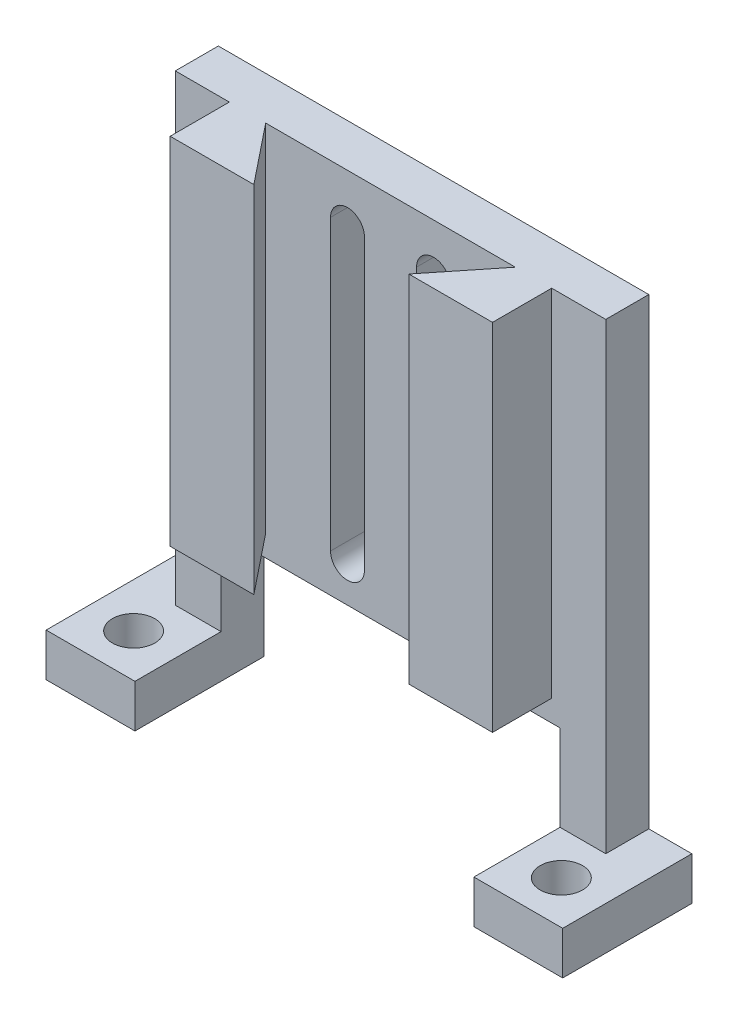
ISO-10303-21;
HEADER;
FILE_DESCRIPTION(('STEP AP214'),'2;1');
FILE_NAME('part.step','',(''),(''),'','','');
FILE_SCHEMA(('AUTOMOTIVE_DESIGN { 1 0 10303 214 1 1 1 1 }'));
ENDSEC;
DATA;
#1=APPLICATION_CONTEXT('core data for automotive mechanical design processes');
#2=APPLICATION_PROTOCOL_DEFINITION('international standard','automotive_design',2000,#1);
#3=PRODUCT_CONTEXT('',#1,'mechanical');
#4=PRODUCT('Part','Part','',(#3));
#5=PRODUCT_RELATED_PRODUCT_CATEGORY('part','',(#4));
#6=PRODUCT_DEFINITION_FORMATION('','',#4);
#7=PRODUCT_DEFINITION_CONTEXT('part definition',#1,'design');
#8=PRODUCT_DEFINITION('design','',#6,#7);
#9=PRODUCT_DEFINITION_SHAPE('','',#8);
#10=(LENGTH_UNIT() NAMED_UNIT(*) SI_UNIT(.MILLI.,.METRE.));
#11=(NAMED_UNIT(*) PLANE_ANGLE_UNIT() SI_UNIT($,.RADIAN.));
#12=(NAMED_UNIT(*) SI_UNIT($,.STERADIAN.) SOLID_ANGLE_UNIT());
#13=UNCERTAINTY_MEASURE_WITH_UNIT(LENGTH_MEASURE(1.E-05),#10,'distance_accuracy_value','');
#14=(GEOMETRIC_REPRESENTATION_CONTEXT(3) GLOBAL_UNCERTAINTY_ASSIGNED_CONTEXT((#13)) GLOBAL_UNIT_ASSIGNED_CONTEXT((#10,
#11,#12)) REPRESENTATION_CONTEXT('',''));
#15=CARTESIAN_POINT('',(0.,0.,0.));
#16=DIRECTION('',(0.,0.,1.));
#17=DIRECTION('',(1.,0.,0.));
#18=AXIS2_PLACEMENT_3D('',#15,#16,#17);
#19=CARTESIAN_POINT('',(0.,0.,5.08));
#20=DIRECTION('',(1.,0.,0.));
#21=DIRECTION('',(0.,0.,-1.));
#22=AXIS2_PLACEMENT_3D('',#19,#20,#21);
#23=PLANE('',#22);
#24=DIRECTION('',(0.,0.,-1.));
#25=VECTOR('',#24,1.);
#26=CARTESIAN_POINT('',(0.,0.,15.24));
#27=LINE('',#26,#25);
#28=CARTESIAN_POINT('',(0.,0.,5.08));
#29=VERTEX_POINT('',#28);
#30=CARTESIAN_POINT('',(0.,0.,0.));
#31=VERTEX_POINT('',#30);
#32=EDGE_CURVE('E41',#29,#31,#27,.T.);
#33=ORIENTED_EDGE('',*,*,#32,.F.);
#34=DIRECTION('',(0.,-1.,0.));
#35=VECTOR('',#34,1.);
#36=CARTESIAN_POINT('',(0.,0.,5.08));
#37=LINE('',#36,#35);
#38=CARTESIAN_POINT('',(0.,54.61,5.08));
#39=VERTEX_POINT('',#38);
#40=EDGE_CURVE('E443',#39,#29,#37,.T.);
#41=ORIENTED_EDGE('',*,*,#40,.F.);
#42=DIRECTION('',(0.,0.,-1.));
#43=VECTOR('',#42,1.);
#44=CARTESIAN_POINT('',(0.,54.61,5.08));
#45=LINE('',#44,#43);
#46=CARTESIAN_POINT('',(0.,54.61,0.));
#47=VERTEX_POINT('',#46);
#48=EDGE_CURVE('E457',#39,#47,#45,.T.);
#49=ORIENTED_EDGE('',*,*,#48,.T.);
#50=DIRECTION('',(0.,-1.,0.));
#51=VECTOR('',#50,1.);
#52=CARTESIAN_POINT('',(0.,0.,0.));
#53=LINE('',#52,#51);
#54=EDGE_CURVE('E434',#47,#31,#53,.T.);
#55=ORIENTED_EDGE('',*,*,#54,.T.);
#56=EDGE_LOOP('',(#33,#41,#49,#55));
#57=FACE_BOUND('',#56,.T.);
#58=ADVANCED_FACE('F33',(#57),#23,.F.);
#59=CARTESIAN_POINT('',(0.,0.,0.));
#60=DIRECTION('',(0.,1.,0.));
#61=DIRECTION('',(0.,0.,1.));
#62=AXIS2_PLACEMENT_3D('',#59,#60,#61);
#63=PLANE('',#62);
#64=CARTESIAN_POINT('',(50.64,0.,10.16));
#65=DIRECTION('',(0.,1.,0.));
#66=DIRECTION('',(0.,0.,-1.));
#67=AXIS2_PLACEMENT_3D('',#64,#65,#66);
#68=CIRCLE('',#67,2.5);
#69=CARTESIAN_POINT('',(50.64,0.,7.65999999999998));
#70=VERTEX_POINT('',#69);
#71=EDGE_CURVE('E579',#70,#70,#68,.T.);
#72=ORIENTED_EDGE('',*,*,#71,.F.);
#73=EDGE_LOOP('',(#72));
#74=FACE_BOUND('',#73,.T.);
#75=DIRECTION('',(0.,0.,-1.));
#76=VECTOR('',#75,1.);
#77=CARTESIAN_POINT('',(45.4,0.,0.));
#78=LINE('',#77,#76);
#79=CARTESIAN_POINT('',(45.4,0.,15.24));
#80=VERTEX_POINT('',#79);
#81=CARTESIAN_POINT('',(45.4,0.,5.08));
#82=VERTEX_POINT('',#81);
#83=EDGE_CURVE('E305',#80,#82,#78,.T.);
#84=ORIENTED_EDGE('',*,*,#83,.F.);
#85=DIRECTION('',(-1.,0.,0.));
#86=VECTOR('',#85,1.);
#87=CARTESIAN_POINT('',(0.,0.,15.24));
#88=LINE('',#87,#86);
#89=CARTESIAN_POINT('',(55.88,0.,15.24));
#90=VERTEX_POINT('',#89);
#91=EDGE_CURVE('E332',#90,#80,#88,.T.);
#92=ORIENTED_EDGE('',*,*,#91,.F.);
#93=DIRECTION('',(0.,0.,-1.));
#94=VECTOR('',#93,1.);
#95=CARTESIAN_POINT('',(55.88,0.,15.24));
#96=LINE('',#95,#94);
#97=CARTESIAN_POINT('',(55.88,0.,0.));
#98=VERTEX_POINT('',#97);
#99=EDGE_CURVE('E250',#90,#98,#96,.T.);
#100=ORIENTED_EDGE('',*,*,#99,.T.);
#101=DIRECTION('',(-1.,0.,0.));
#102=VECTOR('',#101,1.);
#103=CARTESIAN_POINT('',(55.88,0.,0.));
#104=LINE('',#103,#102);
#105=CARTESIAN_POINT('',(50.8,0.,0.));
#106=VERTEX_POINT('',#105);
#107=EDGE_CURVE('E49',#98,#106,#104,.T.);
#108=ORIENTED_EDGE('',*,*,#107,.T.);
#109=DIRECTION('',(0.,0.,-1.));
#110=VECTOR('',#109,1.);
#111=CARTESIAN_POINT('',(50.8,0.,15.24));
#112=LINE('',#111,#110);
#113=CARTESIAN_POINT('',(50.8,0.,5.08));
#114=VERTEX_POINT('',#113);
#115=EDGE_CURVE('E12',#114,#106,#112,.T.);
#116=ORIENTED_EDGE('',*,*,#115,.F.);
#117=DIRECTION('',(1.,0.,0.));
#118=VECTOR('',#117,1.);
#119=CARTESIAN_POINT('',(0.,0.,5.08));
#120=LINE('',#119,#118);
#121=EDGE_CURVE('E446',#82,#114,#120,.T.);
#122=ORIENTED_EDGE('',*,*,#121,.F.);
#123=EDGE_LOOP('',(#84,#92,#100,#108,#116,#122));
#124=FACE_BOUND('',#123,.T.);
#125=ADVANCED_FACE('F537',(#74,#124),#63,.T.);
#126=CARTESIAN_POINT('',(0.,-5.08,15.24));
#127=DIRECTION('',(0.,0.,-1.));
#128=DIRECTION('',(-1.,0.,0.));
#129=AXIS2_PLACEMENT_3D('',#126,#127,#128);
#130=PLANE('',#129);
#131=ORIENTED_EDGE('',*,*,#91,.T.);
#132=DIRECTION('',(0.,-1.,0.));
#133=VECTOR('',#132,1.);
#134=CARTESIAN_POINT('',(45.4,-5.08000000000002,15.24));
#135=LINE('',#134,#133);
#136=CARTESIAN_POINT('',(45.4,-5.08,15.24));
#137=VERTEX_POINT('',#136);
#138=EDGE_CURVE('E237',#80,#137,#135,.T.);
#139=ORIENTED_EDGE('',*,*,#138,.T.);
#140=DIRECTION('',(-1.,0.,0.));
#141=VECTOR('',#140,1.);
#142=CARTESIAN_POINT('',(0.,-5.08,15.24));
#143=LINE('',#142,#141);
#144=CARTESIAN_POINT('',(55.88,-5.08,15.24));
#145=VERTEX_POINT('',#144);
#146=EDGE_CURVE('E231',#145,#137,#143,.T.);
#147=ORIENTED_EDGE('',*,*,#146,.F.);
#148=DIRECTION('',(0.,1.,0.));
#149=VECTOR('',#148,1.);
#150=CARTESIAN_POINT('',(55.88,-5.08,15.24));
#151=LINE('',#150,#149);
#152=EDGE_CURVE('E235',#145,#90,#151,.T.);
#153=ORIENTED_EDGE('',*,*,#152,.T.);
#154=EDGE_LOOP('',(#131,#139,#147,#153));
#155=FACE_BOUND('',#154,.T.);
#156=ADVANCED_FACE('F234',(#155),#130,.F.);
#157=CARTESIAN_POINT('',(0.,-5.08,0.));
#158=DIRECTION('',(0.,1.,0.));
#159=DIRECTION('',(0.,0.,1.));
#160=AXIS2_PLACEMENT_3D('',#157,#158,#159);
#161=PLANE('',#160);
#162=CARTESIAN_POINT('',(50.64,-5.08,10.16));
#163=DIRECTION('',(0.,1.,0.));
#164=DIRECTION('',(0.,0.,-1.));
#165=AXIS2_PLACEMENT_3D('',#162,#163,#164);
#166=CIRCLE('',#165,2.5);
#167=CARTESIAN_POINT('',(50.64,-5.08,7.65999999999998));
#168=VERTEX_POINT('',#167);
#169=EDGE_CURVE('E574',#168,#168,#166,.T.);
#170=ORIENTED_EDGE('',*,*,#169,.T.);
#171=EDGE_LOOP('',(#170));
#172=FACE_BOUND('',#171,.T.);
#173=ORIENTED_EDGE('',*,*,#146,.T.);
#174=DIRECTION('',(0.,0.,1.));
#175=VECTOR('',#174,1.);
#176=CARTESIAN_POINT('',(45.4,-5.08,-42.8048782266694));
#177=LINE('',#176,#175);
#178=CARTESIAN_POINT('',(45.4,-5.08,0.));
#179=VERTEX_POINT('',#178);
#180=EDGE_CURVE('E279',#179,#137,#177,.T.);
#181=ORIENTED_EDGE('',*,*,#180,.F.);
#182=DIRECTION('',(1.,0.,0.));
#183=VECTOR('',#182,1.);
#184=CARTESIAN_POINT('',(0.,-5.08,0.));
#185=LINE('',#184,#183);
#186=CARTESIAN_POINT('',(55.88,-5.08,0.));
#187=VERTEX_POINT('',#186);
#188=EDGE_CURVE('E255',#179,#187,#185,.T.);
#189=ORIENTED_EDGE('',*,*,#188,.T.);
#190=DIRECTION('',(0.,0.,1.));
#191=VECTOR('',#190,1.);
#192=CARTESIAN_POINT('',(55.88,-5.08,15.24));
#193=LINE('',#192,#191);
#194=EDGE_CURVE('E248',#187,#145,#193,.T.);
#195=ORIENTED_EDGE('',*,*,#194,.T.);
#196=EDGE_LOOP('',(#173,#181,#189,#195));
#197=FACE_BOUND('',#196,.T.);
#198=ADVANCED_FACE('F253',(#172,#197),#161,.F.);
#199=CARTESIAN_POINT('',(50.8,0.,5.08));
#200=DIRECTION('',(-1.,0.,0.));
#201=DIRECTION('',(0.,0.,1.));
#202=AXIS2_PLACEMENT_3D('',#199,#200,#201);
#203=PLANE('',#202);
#204=DIRECTION('',(0.,1.,0.));
#205=VECTOR('',#204,1.);
#206=CARTESIAN_POINT('',(50.8,0.,5.08));
#207=LINE('',#206,#205);
#208=CARTESIAN_POINT('',(50.8,54.61,5.08));
#209=VERTEX_POINT('',#208);
#210=EDGE_CURVE('E451',#114,#209,#207,.T.);
#211=ORIENTED_EDGE('',*,*,#210,.F.);
#212=ORIENTED_EDGE('',*,*,#115,.T.);
#213=DIRECTION('',(0.,1.,0.));
#214=VECTOR('',#213,1.);
#215=CARTESIAN_POINT('',(50.8,0.,0.));
#216=LINE('',#215,#214);
#217=CARTESIAN_POINT('',(50.8,54.61,0.));
#218=VERTEX_POINT('',#217);
#219=EDGE_CURVE('E460',#106,#218,#216,.T.);
#220=ORIENTED_EDGE('',*,*,#219,.T.);
#221=DIRECTION('',(0.,0.,-1.));
#222=VECTOR('',#221,1.);
#223=CARTESIAN_POINT('',(50.8,54.61,5.08));
#224=LINE('',#223,#222);
#225=EDGE_CURVE('E464',#209,#218,#224,.T.);
#226=ORIENTED_EDGE('',*,*,#225,.F.);
#227=EDGE_LOOP('',(#211,#212,#220,#226));
#228=FACE_BOUND('',#227,.T.);
#229=ADVANCED_FACE('F505',(#228),#203,.F.);
#230=CARTESIAN_POINT('',(0.,54.61,5.08));
#231=DIRECTION('',(0.,-1.,0.));
#232=DIRECTION('',(0.,0.,-1.));
#233=AXIS2_PLACEMENT_3D('',#230,#231,#232);
#234=PLANE('',#233);
#235=DIRECTION('',(-1.,0.,0.));
#236=VECTOR('',#235,1.);
#237=CARTESIAN_POINT('',(0.,54.61,0.));
#238=LINE('',#237,#236);
#239=EDGE_CURVE('E447',#218,#47,#238,.T.);
#240=ORIENTED_EDGE('',*,*,#239,.T.);
#241=ORIENTED_EDGE('',*,*,#48,.F.);
#242=DIRECTION('',(-1.,0.,0.));
#243=VECTOR('',#242,1.);
#244=CARTESIAN_POINT('',(0.,54.61,5.08));
#245=LINE('',#244,#243);
#246=CARTESIAN_POINT('',(6.38056504409611,54.61,5.08));
#247=VERTEX_POINT('',#246);
#248=EDGE_CURVE('E453',#247,#39,#245,.T.);
#249=ORIENTED_EDGE('',*,*,#248,.F.);
#250=DIRECTION('',(0.,0.,-1.));
#251=VECTOR('',#250,1.);
#252=CARTESIAN_POINT('',(6.38056504409611,54.61,5.08));
#253=LINE('',#252,#251);
#254=CARTESIAN_POINT('',(6.38056504409611,54.61,12.065));
#255=VERTEX_POINT('',#254);
#256=EDGE_CURVE('E401',#255,#247,#253,.T.);
#257=ORIENTED_EDGE('',*,*,#256,.F.);
#258=DIRECTION('',(-1.,0.,0.));
#259=VECTOR('',#258,1.);
#260=CARTESIAN_POINT('',(6.38056504409611,54.61,12.065));
#261=LINE('',#260,#259);
#262=CARTESIAN_POINT('',(16.256,54.61,12.065));
#263=VERTEX_POINT('',#262);
#264=EDGE_CURVE('E407',#263,#255,#261,.T.);
#265=ORIENTED_EDGE('',*,*,#264,.F.);
#266=DIRECTION('',(0.624695047554424,0.,0.78086880944303));
#267=VECTOR('',#266,1.);
#268=CARTESIAN_POINT('',(16.256,54.61,12.065));
#269=LINE('',#268,#267);
#270=CARTESIAN_POINT('',(10.668,54.61,5.08));
#271=VERTEX_POINT('',#270);
#272=EDGE_CURVE('E404',#271,#263,#269,.T.);
#273=ORIENTED_EDGE('',*,*,#272,.F.);
#274=CARTESIAN_POINT('',(40.132,54.61,5.08));
#275=VERTEX_POINT('',#274);
#276=EDGE_CURVE('E458',#275,#271,#245,.T.);
#277=ORIENTED_EDGE('',*,*,#276,.F.);
#278=DIRECTION('',(0.624695047554424,0.,-0.78086880944303));
#279=VECTOR('',#278,1.);
#280=CARTESIAN_POINT('',(34.544,54.61,12.065));
#281=LINE('',#280,#279);
#282=CARTESIAN_POINT('',(34.544,54.61,12.065));
#283=VERTEX_POINT('',#282);
#284=EDGE_CURVE('E425',#283,#275,#281,.T.);
#285=ORIENTED_EDGE('',*,*,#284,.F.);
#286=DIRECTION('',(-1.,0.,0.));
#287=VECTOR('',#286,1.);
#288=CARTESIAN_POINT('',(44.4194349559039,54.61,12.065));
#289=LINE('',#288,#287);
#290=CARTESIAN_POINT('',(44.4194349559039,54.61,12.065));
#291=VERTEX_POINT('',#290);
#292=EDGE_CURVE('E414',#291,#283,#289,.T.);
#293=ORIENTED_EDGE('',*,*,#292,.F.);
#294=DIRECTION('',(0.,0.,1.));
#295=VECTOR('',#294,1.);
#296=CARTESIAN_POINT('',(44.4194349559039,54.61,5.08));
#297=LINE('',#296,#295);
#298=CARTESIAN_POINT('',(44.4194349559039,54.61,5.08));
#299=VERTEX_POINT('',#298);
#300=EDGE_CURVE('E427',#299,#291,#297,.T.);
#301=ORIENTED_EDGE('',*,*,#300,.F.);
#302=EDGE_CURVE('E454',#209,#299,#245,.T.);
#303=ORIENTED_EDGE('',*,*,#302,.F.);
#304=ORIENTED_EDGE('',*,*,#225,.T.);
#305=EDGE_LOOP('',(#240,#241,#249,#257,#265,#273,#277,#285,#293,#301,#303,#304));
#306=FACE_BOUND('',#305,.T.);
#307=ADVANCED_FACE('F484',(#306),#234,.F.);
#308=CARTESIAN_POINT('',(0.,0.,5.08));
#309=DIRECTION('',(0.,0.,-1.));
#310=DIRECTION('',(-1.,0.,0.));
#311=AXIS2_PLACEMENT_3D('',#308,#309,#310);
#312=PLANE('',#311);
#313=CARTESIAN_POINT('',(20.32,14.7,5.08));
#314=DIRECTION('',(0.,0.,-1.));
#315=DIRECTION('',(-1.,0.,0.));
#316=AXIS2_PLACEMENT_3D('',#313,#314,#315);
#317=CIRCLE('',#316,1.99999999999999);
#318=CARTESIAN_POINT('',(22.32,14.7,5.08));
#319=VERTEX_POINT('',#318);
#320=CARTESIAN_POINT('',(18.32,14.7,5.08));
#321=VERTEX_POINT('',#320);
#322=EDGE_CURVE('E393',#319,#321,#317,.T.);
#323=ORIENTED_EDGE('',*,*,#322,.T.);
#324=DIRECTION('',(0.,1.,0.));
#325=VECTOR('',#324,1.);
#326=CARTESIAN_POINT('',(18.32,0.,5.08));
#327=LINE('',#326,#325);
#328=CARTESIAN_POINT('',(18.32,48.8,5.08));
#329=VERTEX_POINT('',#328);
#330=EDGE_CURVE('E390',#321,#329,#327,.T.);
#331=ORIENTED_EDGE('',*,*,#330,.T.);
#332=CARTESIAN_POINT('',(20.32,48.8,5.08));
#333=DIRECTION('',(0.,0.,-1.));
#334=DIRECTION('',(-1.,0.,0.));
#335=AXIS2_PLACEMENT_3D('',#332,#333,#334);
#336=CIRCLE('',#335,2.);
#337=CARTESIAN_POINT('',(22.32,48.8,5.08));
#338=VERTEX_POINT('',#337);
#339=EDGE_CURVE('E398',#329,#338,#336,.T.);
#340=ORIENTED_EDGE('',*,*,#339,.T.);
#341=DIRECTION('',(0.,-1.,0.));
#342=VECTOR('',#341,1.);
#343=CARTESIAN_POINT('',(22.32,0.,5.08));
#344=LINE('',#343,#342);
#345=EDGE_CURVE('E395',#338,#319,#344,.T.);
#346=ORIENTED_EDGE('',*,*,#345,.T.);
#347=EDGE_LOOP('',(#323,#331,#340,#346));
#348=FACE_BOUND('',#347,.T.);
#349=CARTESIAN_POINT('',(30.48,14.7,5.08));
#350=DIRECTION('',(0.,0.,-1.));
#351=DIRECTION('',(-1.,0.,0.));
#352=AXIS2_PLACEMENT_3D('',#349,#350,#351);
#353=CIRCLE('',#352,1.99999999999999);
#354=CARTESIAN_POINT('',(32.48,14.7,5.08));
#355=VERTEX_POINT('',#354);
#356=CARTESIAN_POINT('',(28.48,14.7,5.08));
#357=VERTEX_POINT('',#356);
#358=EDGE_CURVE('E382',#355,#357,#353,.T.);
#359=ORIENTED_EDGE('',*,*,#358,.T.);
#360=DIRECTION('',(0.,1.,0.));
#361=VECTOR('',#360,1.);
#362=CARTESIAN_POINT('',(28.48,0.,5.08));
#363=LINE('',#362,#361);
#364=CARTESIAN_POINT('',(28.48,48.8,5.08));
#365=VERTEX_POINT('',#364);
#366=EDGE_CURVE('E351',#357,#365,#363,.T.);
#367=ORIENTED_EDGE('',*,*,#366,.T.);
#368=CARTESIAN_POINT('',(30.48,48.8,5.08));
#369=DIRECTION('',(0.,0.,-1.));
#370=DIRECTION('',(-1.,0.,0.));
#371=AXIS2_PLACEMENT_3D('',#368,#369,#370);
#372=CIRCLE('',#371,2.);
#373=CARTESIAN_POINT('',(32.48,48.8,5.08));
#374=VERTEX_POINT('',#373);
#375=EDGE_CURVE('E387',#365,#374,#372,.T.);
#376=ORIENTED_EDGE('',*,*,#375,.T.);
#377=DIRECTION('',(0.,-1.,0.));
#378=VECTOR('',#377,1.);
#379=CARTESIAN_POINT('',(32.48,0.,5.08));
#380=LINE('',#379,#378);
#381=EDGE_CURVE('E384',#374,#355,#380,.T.);
#382=ORIENTED_EDGE('',*,*,#381,.T.);
#383=EDGE_LOOP('',(#359,#367,#376,#382));
#384=FACE_BOUND('',#383,.T.);
#385=DIRECTION('',(1.,0.,0.));
#386=VECTOR('',#385,1.);
#387=CARTESIAN_POINT('',(0.,10.16,5.08));
#388=LINE('',#387,#386);
#389=CARTESIAN_POINT('',(5.39999999999999,10.16,5.07999999999999));
#390=VERTEX_POINT('',#389);
#391=CARTESIAN_POINT('',(45.4,10.16,5.07999999999999));
#392=VERTEX_POINT('',#391);
#393=EDGE_CURVE('E310',#390,#392,#388,.T.);
#394=ORIENTED_EDGE('',*,*,#393,.T.);
#395=DIRECTION('',(0.,-1.,0.));
#396=VECTOR('',#395,1.);
#397=CARTESIAN_POINT('',(45.4,0.,5.08));
#398=LINE('',#397,#396);
#399=EDGE_CURVE('E307',#392,#82,#398,.T.);
#400=ORIENTED_EDGE('',*,*,#399,.T.);
#401=ORIENTED_EDGE('',*,*,#121,.T.);
#402=ORIENTED_EDGE('',*,*,#210,.T.);
#403=ORIENTED_EDGE('',*,*,#302,.T.);
#404=DIRECTION('',(0.,-1.,0.));
#405=VECTOR('',#404,1.);
#406=CARTESIAN_POINT('',(44.4194349559039,54.61,5.08));
#407=LINE('',#406,#405);
#408=CARTESIAN_POINT('',(44.4194349559039,12.7,5.07999999999999));
#409=VERTEX_POINT('',#408);
#410=EDGE_CURVE('E435',#299,#409,#407,.T.);
#411=ORIENTED_EDGE('',*,*,#410,.T.);
#412=DIRECTION('',(-1.,0.,0.));
#413=VECTOR('',#412,1.);
#414=CARTESIAN_POINT('',(58.9135794632558,12.7,5.07999999999999));
#415=LINE('',#414,#413);
#416=CARTESIAN_POINT('',(40.132,12.7,5.07999999999999));
#417=VERTEX_POINT('',#416);
#418=EDGE_CURVE('E322',#409,#417,#415,.T.);
#419=ORIENTED_EDGE('',*,*,#418,.T.);
#420=DIRECTION('',(0.,-1.,0.));
#421=VECTOR('',#420,1.);
#422=CARTESIAN_POINT('',(40.132,54.61,5.08));
#423=LINE('',#422,#421);
#424=EDGE_CURVE('E438',#275,#417,#423,.T.);
#425=ORIENTED_EDGE('',*,*,#424,.F.);
#426=ORIENTED_EDGE('',*,*,#276,.T.);
#427=DIRECTION('',(0.,-1.,0.));
#428=VECTOR('',#427,1.);
#429=CARTESIAN_POINT('',(10.668,54.61,5.08));
#430=LINE('',#429,#428);
#431=CARTESIAN_POINT('',(10.668,12.7,5.07999999999999));
#432=VERTEX_POINT('',#431);
#433=EDGE_CURVE('E418',#271,#432,#430,.T.);
#434=ORIENTED_EDGE('',*,*,#433,.T.);
#435=CARTESIAN_POINT('',(6.38056504409611,12.7,5.07999999999999));
#436=VERTEX_POINT('',#435);
#437=EDGE_CURVE('E320',#432,#436,#415,.T.);
#438=ORIENTED_EDGE('',*,*,#437,.T.);
#439=DIRECTION('',(0.,-1.,0.));
#440=VECTOR('',#439,1.);
#441=CARTESIAN_POINT('',(6.38056504409611,54.61,5.08));
#442=LINE('',#441,#440);
#443=EDGE_CURVE('E410',#247,#436,#442,.T.);
#444=ORIENTED_EDGE('',*,*,#443,.F.);
#445=ORIENTED_EDGE('',*,*,#248,.T.);
#446=ORIENTED_EDGE('',*,*,#40,.T.);
#447=CARTESIAN_POINT('',(5.4,0.,5.08));
#448=VERTEX_POINT('',#447);
#449=EDGE_CURVE('E448',#29,#448,#120,.T.);
#450=ORIENTED_EDGE('',*,*,#449,.T.);
#451=DIRECTION('',(0.,1.,0.));
#452=VECTOR('',#451,1.);
#453=CARTESIAN_POINT('',(5.4,0.,5.08));
#454=LINE('',#453,#452);
#455=EDGE_CURVE('E301',#448,#390,#454,.T.);
#456=ORIENTED_EDGE('',*,*,#455,.T.);
#457=EDGE_LOOP('',(#394,#400,#401,#402,#403,#411,#419,#425,#426,#434,#438,#444,#445,#446,#450,#456));
#458=FACE_BOUND('',#457,.T.);
#459=ADVANCED_FACE('F490',(#348,#384,#458),#312,.F.);
#460=CARTESIAN_POINT('',(0.,0.,0.));
#461=DIRECTION('',(0.,0.,-1.));
#462=DIRECTION('',(-1.,0.,0.));
#463=AXIS2_PLACEMENT_3D('',#460,#461,#462);
#464=PLANE('',#463);
#465=DIRECTION('',(0.,1.,0.));
#466=VECTOR('',#465,1.);
#467=CARTESIAN_POINT('',(45.4,-5.08,0.));
#468=LINE('',#467,#466);
#469=CARTESIAN_POINT('',(45.4,10.16,0.));
#470=VERTEX_POINT('',#469);
#471=EDGE_CURVE('E289',#179,#470,#468,.T.);
#472=ORIENTED_EDGE('',*,*,#471,.T.);
#473=DIRECTION('',(-1.,0.,0.));
#474=VECTOR('',#473,1.);
#475=CARTESIAN_POINT('',(5.39999999999999,10.16,0.));
#476=LINE('',#475,#474);
#477=CARTESIAN_POINT('',(5.39999999999999,10.16,0.));
#478=VERTEX_POINT('',#477);
#479=EDGE_CURVE('E285',#470,#478,#476,.T.);
#480=ORIENTED_EDGE('',*,*,#479,.T.);
#481=DIRECTION('',(0.,-1.,0.));
#482=VECTOR('',#481,1.);
#483=CARTESIAN_POINT('',(5.40000000000001,-5.08000000000001,0.));
#484=LINE('',#483,#482);
#485=CARTESIAN_POINT('',(5.40000000000001,-5.08000000000001,0.));
#486=VERTEX_POINT('',#485);
#487=EDGE_CURVE('E280',#478,#486,#484,.T.);
#488=ORIENTED_EDGE('',*,*,#487,.T.);
#489=CARTESIAN_POINT('',(-5.08,-5.08,0.));
#490=VERTEX_POINT('',#489);
#491=EDGE_CURVE('E329',#490,#486,#185,.T.);
#492=ORIENTED_EDGE('',*,*,#491,.F.);
#493=DIRECTION('',(0.,-1.,0.));
#494=VECTOR('',#493,1.);
#495=CARTESIAN_POINT('',(-5.08,-5.08,0.));
#496=LINE('',#495,#494);
#497=CARTESIAN_POINT('',(-5.08,0.,0.));
#498=VERTEX_POINT('',#497);
#499=EDGE_CURVE('E268',#498,#490,#496,.T.);
#500=ORIENTED_EDGE('',*,*,#499,.F.);
#501=DIRECTION('',(1.,0.,0.));
#502=VECTOR('',#501,1.);
#503=CARTESIAN_POINT('',(-5.08,0.,0.));
#504=LINE('',#503,#502);
#505=EDGE_CURVE('E274',#498,#31,#504,.T.);
#506=ORIENTED_EDGE('',*,*,#505,.T.);
#507=ORIENTED_EDGE('',*,*,#54,.F.);
#508=ORIENTED_EDGE('',*,*,#239,.F.);
#509=ORIENTED_EDGE('',*,*,#219,.F.);
#510=ORIENTED_EDGE('',*,*,#107,.F.);
#511=DIRECTION('',(0.,-1.,0.));
#512=VECTOR('',#511,1.);
#513=CARTESIAN_POINT('',(55.88,-5.08,0.));
#514=LINE('',#513,#512);
#515=EDGE_CURVE('E256',#98,#187,#514,.T.);
#516=ORIENTED_EDGE('',*,*,#515,.T.);
#517=ORIENTED_EDGE('',*,*,#188,.F.);
#518=EDGE_LOOP('',(#472,#480,#488,#492,#500,#506,#507,#508,#509,#510,#516,#517));
#519=FACE_BOUND('',#518,.T.);
#520=CARTESIAN_POINT('',(20.32,48.8,0.));
#521=DIRECTION('',(0.,0.,1.));
#522=DIRECTION('',(1.,0.,0.));
#523=AXIS2_PLACEMENT_3D('',#520,#521,#522);
#524=CIRCLE('',#523,2.);
#525=CARTESIAN_POINT('',(22.32,48.8,0.));
#526=VERTEX_POINT('',#525);
#527=CARTESIAN_POINT('',(18.32,48.8,0.));
#528=VERTEX_POINT('',#527);
#529=EDGE_CURVE('E334',#526,#528,#524,.T.);
#530=ORIENTED_EDGE('',*,*,#529,.T.);
#531=DIRECTION('',(0.,-1.,0.));
#532=VECTOR('',#531,1.);
#533=CARTESIAN_POINT('',(18.32,48.8,0.));
#534=LINE('',#533,#532);
#535=CARTESIAN_POINT('',(18.32,14.7,0.));
#536=VERTEX_POINT('',#535);
#537=EDGE_CURVE('E337',#528,#536,#534,.T.);
#538=ORIENTED_EDGE('',*,*,#537,.T.);
#539=CARTESIAN_POINT('',(20.32,14.7,0.));
#540=DIRECTION('',(0.,0.,1.));
#541=DIRECTION('',(1.,0.,0.));
#542=AXIS2_PLACEMENT_3D('',#539,#540,#541);
#543=CIRCLE('',#542,1.99999999999999);
#544=CARTESIAN_POINT('',(22.32,14.7,0.));
#545=VERTEX_POINT('',#544);
#546=EDGE_CURVE('E341',#536,#545,#543,.T.);
#547=ORIENTED_EDGE('',*,*,#546,.T.);
#548=DIRECTION('',(0.,1.,0.));
#549=VECTOR('',#548,1.);
#550=CARTESIAN_POINT('',(22.32,48.8,0.));
#551=LINE('',#550,#549);
#552=EDGE_CURVE('E344',#545,#526,#551,.T.);
#553=ORIENTED_EDGE('',*,*,#552,.T.);
#554=EDGE_LOOP('',(#530,#538,#547,#553));
#555=FACE_BOUND('',#554,.T.);
#556=CARTESIAN_POINT('',(30.48,48.8,0.));
#557=DIRECTION('',(0.,0.,1.));
#558=DIRECTION('',(-1.,0.,0.));
#559=AXIS2_PLACEMENT_3D('',#556,#557,#558);
#560=CIRCLE('',#559,2.);
#561=CARTESIAN_POINT('',(32.48,48.8,0.));
#562=VERTEX_POINT('',#561);
#563=CARTESIAN_POINT('',(28.48,48.8,0.));
#564=VERTEX_POINT('',#563);
#565=EDGE_CURVE('E241',#562,#564,#560,.T.);
#566=ORIENTED_EDGE('',*,*,#565,.T.);
#567=DIRECTION('',(0.,-1.,0.));
#568=VECTOR('',#567,1.);
#569=CARTESIAN_POINT('',(28.48,48.8,0.));
#570=LINE('',#569,#568);
#571=CARTESIAN_POINT('',(28.48,14.7,0.));
#572=VERTEX_POINT('',#571);
#573=EDGE_CURVE('E361',#564,#572,#570,.T.);
#574=ORIENTED_EDGE('',*,*,#573,.T.);
#575=CARTESIAN_POINT('',(30.48,14.7,0.));
#576=DIRECTION('',(0.,0.,1.));
#577=DIRECTION('',(-1.,0.,0.));
#578=AXIS2_PLACEMENT_3D('',#575,#576,#577);
#579=CIRCLE('',#578,1.99999999999999);
#580=CARTESIAN_POINT('',(32.48,14.7,0.));
#581=VERTEX_POINT('',#580);
#582=EDGE_CURVE('E364',#572,#581,#579,.T.);
#583=ORIENTED_EDGE('',*,*,#582,.T.);
#584=DIRECTION('',(0.,1.,0.));
#585=VECTOR('',#584,1.);
#586=CARTESIAN_POINT('',(32.48,48.8,0.));
#587=LINE('',#586,#585);
#588=EDGE_CURVE('E367',#581,#562,#587,.T.);
#589=ORIENTED_EDGE('',*,*,#588,.T.);
#590=EDGE_LOOP('',(#566,#574,#583,#589));
#591=FACE_BOUND('',#590,.T.);
#592=ADVANCED_FACE('F508',(#519,#555,#591),#464,.T.);
#593=CARTESIAN_POINT('',(44.4194349559039,54.61,12.065));
#594=DIRECTION('',(0.,0.,1.));
#595=DIRECTION('',(1.,0.,0.));
#596=AXIS2_PLACEMENT_3D('',#593,#594,#595);
#597=PLANE('',#596);
#598=DIRECTION('',(-1.,0.,0.));
#599=VECTOR('',#598,1.);
#600=CARTESIAN_POINT('',(58.9135794632558,12.7,12.065));
#601=LINE('',#600,#599);
#602=CARTESIAN_POINT('',(44.4194349559039,12.7,12.065));
#603=VERTEX_POINT('',#602);
#604=CARTESIAN_POINT('',(34.544,12.7,12.065));
#605=VERTEX_POINT('',#604);
#606=EDGE_CURVE('E321',#603,#605,#601,.T.);
#607=ORIENTED_EDGE('',*,*,#606,.F.);
#608=DIRECTION('',(0.,-1.,0.));
#609=VECTOR('',#608,1.);
#610=CARTESIAN_POINT('',(44.4194349559039,54.61,12.065));
#611=LINE('',#610,#609);
#612=EDGE_CURVE('E431',#291,#603,#611,.T.);
#613=ORIENTED_EDGE('',*,*,#612,.F.);
#614=ORIENTED_EDGE('',*,*,#292,.T.);
#615=DIRECTION('',(0.,-1.,0.));
#616=VECTOR('',#615,1.);
#617=CARTESIAN_POINT('',(34.544,54.61,12.065));
#618=LINE('',#617,#616);
#619=EDGE_CURVE('E430',#283,#605,#618,.T.);
#620=ORIENTED_EDGE('',*,*,#619,.T.);
#621=EDGE_LOOP('',(#607,#613,#614,#620));
#622=FACE_BOUND('',#621,.T.);
#623=ADVANCED_FACE('F498',(#622),#597,.T.);
#624=CARTESIAN_POINT('',(44.4194349559039,54.61,5.08));
#625=DIRECTION('',(1.,0.,0.));
#626=DIRECTION('',(0.,0.,-1.));
#627=AXIS2_PLACEMENT_3D('',#624,#625,#626);
#628=PLANE('',#627);
#629=DIRECTION('',(0.,0.,-1.));
#630=VECTOR('',#629,1.);
#631=CARTESIAN_POINT('',(44.4194349559039,12.7,5.07999999999999));
#632=LINE('',#631,#630);
#633=EDGE_CURVE('E317',#603,#409,#632,.T.);
#634=ORIENTED_EDGE('',*,*,#633,.T.);
#635=ORIENTED_EDGE('',*,*,#410,.F.);
#636=ORIENTED_EDGE('',*,*,#300,.T.);
#637=ORIENTED_EDGE('',*,*,#612,.T.);
#638=EDGE_LOOP('',(#634,#635,#636,#637));
#639=FACE_BOUND('',#638,.T.);
#640=ADVANCED_FACE('F500',(#639),#628,.T.);
#641=CARTESIAN_POINT('',(34.544,54.61,12.065));
#642=DIRECTION('',(-0.78086880944303,0.,-0.624695047554424));
#643=DIRECTION('',(-0.624695047554424,0.,0.78086880944303));
#644=AXIS2_PLACEMENT_3D('',#641,#642,#643);
#645=PLANE('',#644);
#646=DIRECTION('',(0.624695047554424,0.,-0.78086880944303));
#647=VECTOR('',#646,1.);
#648=CARTESIAN_POINT('',(34.544,12.7,12.065));
#649=LINE('',#648,#647);
#650=EDGE_CURVE('E325',#605,#417,#649,.T.);
#651=ORIENTED_EDGE('',*,*,#650,.F.);
#652=ORIENTED_EDGE('',*,*,#619,.F.);
#653=ORIENTED_EDGE('',*,*,#284,.T.);
#654=ORIENTED_EDGE('',*,*,#424,.T.);
#655=EDGE_LOOP('',(#651,#652,#653,#654));
#656=FACE_BOUND('',#655,.T.);
#657=ADVANCED_FACE('F706',(#656),#645,.T.);
#658=CARTESIAN_POINT('',(6.38056504409611,54.61,5.08));
#659=DIRECTION('',(-1.,0.,0.));
#660=DIRECTION('',(0.,0.,1.));
#661=AXIS2_PLACEMENT_3D('',#658,#659,#660);
#662=PLANE('',#661);
#663=DIRECTION('',(0.,0.,-1.));
#664=VECTOR('',#663,1.);
#665=CARTESIAN_POINT('',(6.38056504409611,12.7,5.07999999999999));
#666=LINE('',#665,#664);
#667=CARTESIAN_POINT('',(6.38056504409611,12.7,12.065));
#668=VERTEX_POINT('',#667);
#669=EDGE_CURVE('E313',#668,#436,#666,.T.);
#670=ORIENTED_EDGE('',*,*,#669,.F.);
#671=DIRECTION('',(0.,-1.,0.));
#672=VECTOR('',#671,1.);
#673=CARTESIAN_POINT('',(6.38056504409611,54.61,12.065));
#674=LINE('',#673,#672);
#675=EDGE_CURVE('E411',#255,#668,#674,.T.);
#676=ORIENTED_EDGE('',*,*,#675,.F.);
#677=ORIENTED_EDGE('',*,*,#256,.T.);
#678=ORIENTED_EDGE('',*,*,#443,.T.);
#679=EDGE_LOOP('',(#670,#676,#677,#678));
#680=FACE_BOUND('',#679,.T.);
#681=ADVANCED_FACE('F488',(#680),#662,.T.);
#682=CARTESIAN_POINT('',(6.38056504409611,54.61,12.065));
#683=DIRECTION('',(0.,0.,1.));
#684=DIRECTION('',(1.,0.,0.));
#685=AXIS2_PLACEMENT_3D('',#682,#683,#684);
#686=PLANE('',#685);
#687=CARTESIAN_POINT('',(16.256,12.7,12.065));
#688=VERTEX_POINT('',#687);
#689=EDGE_CURVE('E316',#688,#668,#601,.T.);
#690=ORIENTED_EDGE('',*,*,#689,.F.);
#691=DIRECTION('',(0.,-1.,0.));
#692=VECTOR('',#691,1.);
#693=CARTESIAN_POINT('',(16.256,54.61,12.065));
#694=LINE('',#693,#692);
#695=EDGE_CURVE('E415',#263,#688,#694,.T.);
#696=ORIENTED_EDGE('',*,*,#695,.F.);
#697=ORIENTED_EDGE('',*,*,#264,.T.);
#698=ORIENTED_EDGE('',*,*,#675,.T.);
#699=EDGE_LOOP('',(#690,#696,#697,#698));
#700=FACE_BOUND('',#699,.T.);
#701=ADVANCED_FACE('F478',(#700),#686,.T.);
#702=CARTESIAN_POINT('',(16.256,54.61,12.065));
#703=DIRECTION('',(0.78086880944303,0.,-0.624695047554424));
#704=DIRECTION('',(-0.624695047554424,0.,-0.780868809443031));
#705=AXIS2_PLACEMENT_3D('',#702,#703,#704);
#706=PLANE('',#705);
#707=DIRECTION('',(0.624695047554424,0.,0.780868809443031));
#708=VECTOR('',#707,1.);
#709=CARTESIAN_POINT('',(16.256,12.7,12.065));
#710=LINE('',#709,#708);
#711=EDGE_CURVE('E36',#432,#688,#710,.T.);
#712=ORIENTED_EDGE('',*,*,#711,.F.);
#713=ORIENTED_EDGE('',*,*,#433,.F.);
#714=ORIENTED_EDGE('',*,*,#272,.T.);
#715=ORIENTED_EDGE('',*,*,#695,.T.);
#716=EDGE_LOOP('',(#712,#713,#714,#715));
#717=FACE_BOUND('',#716,.T.);
#718=ADVANCED_FACE('F479',(#717),#706,.T.);
#719=CARTESIAN_POINT('',(30.48,48.8,0.));
#720=DIRECTION('',(0.,0.,1.));
#721=DIRECTION('',(1.,0.,0.));
#722=AXIS2_PLACEMENT_3D('',#719,#720,#721);
#723=CYLINDRICAL_SURFACE('',#722,2.);
#724=DIRECTION('',(0.,0.,1.));
#725=VECTOR('',#724,1.);
#726=CARTESIAN_POINT('',(28.48,48.8,0.));
#727=LINE('',#726,#725);
#728=EDGE_CURVE('E370',#564,#365,#727,.T.);
#729=ORIENTED_EDGE('',*,*,#728,.F.);
#730=ORIENTED_EDGE('',*,*,#565,.F.);
#731=DIRECTION('',(0.,0.,1.));
#732=VECTOR('',#731,1.);
#733=CARTESIAN_POINT('',(32.48,48.8,0.));
#734=LINE('',#733,#732);
#735=EDGE_CURVE('E338',#562,#374,#734,.T.);
#736=ORIENTED_EDGE('',*,*,#735,.T.);
#737=ORIENTED_EDGE('',*,*,#375,.F.);
#738=EDGE_LOOP('',(#729,#730,#736,#737));
#739=FACE_BOUND('',#738,.T.);
#740=ADVANCED_FACE('F731',(#739),#723,.F.);
#741=CARTESIAN_POINT('',(32.48,48.8,0.));
#742=DIRECTION('',(1.,0.,0.));
#743=DIRECTION('',(0.,1.,0.));
#744=AXIS2_PLACEMENT_3D('',#741,#742,#743);
#745=PLANE('',#744);
#746=ORIENTED_EDGE('',*,*,#735,.F.);
#747=ORIENTED_EDGE('',*,*,#588,.F.);
#748=DIRECTION('',(0.,0.,1.));
#749=VECTOR('',#748,1.);
#750=CARTESIAN_POINT('',(32.48,14.7,0.));
#751=LINE('',#750,#749);
#752=EDGE_CURVE('E373',#581,#355,#751,.T.);
#753=ORIENTED_EDGE('',*,*,#752,.T.);
#754=ORIENTED_EDGE('',*,*,#381,.F.);
#755=EDGE_LOOP('',(#746,#747,#753,#754));
#756=FACE_BOUND('',#755,.T.);
#757=ADVANCED_FACE('F739',(#756),#745,.F.);
#758=CARTESIAN_POINT('',(30.48,14.7,0.));
#759=DIRECTION('',(0.,0.,1.));
#760=DIRECTION('',(1.,0.,0.));
#761=AXIS2_PLACEMENT_3D('',#758,#759,#760);
#762=CYLINDRICAL_SURFACE('',#761,1.99999999999999);
#763=ORIENTED_EDGE('',*,*,#752,.F.);
#764=ORIENTED_EDGE('',*,*,#582,.F.);
#765=DIRECTION('',(0.,0.,1.));
#766=VECTOR('',#765,1.);
#767=CARTESIAN_POINT('',(28.48,14.7,0.));
#768=LINE('',#767,#766);
#769=EDGE_CURVE('E376',#572,#357,#768,.T.);
#770=ORIENTED_EDGE('',*,*,#769,.T.);
#771=ORIENTED_EDGE('',*,*,#358,.F.);
#772=EDGE_LOOP('',(#763,#764,#770,#771));
#773=FACE_BOUND('',#772,.T.);
#774=ADVANCED_FACE('F748',(#773),#762,.F.);
#775=CARTESIAN_POINT('',(28.48,48.8,0.));
#776=DIRECTION('',(-1.,0.,0.));
#777=DIRECTION('',(0.,0.,1.));
#778=AXIS2_PLACEMENT_3D('',#775,#776,#777);
#779=PLANE('',#778);
#780=ORIENTED_EDGE('',*,*,#769,.F.);
#781=ORIENTED_EDGE('',*,*,#573,.F.);
#782=ORIENTED_EDGE('',*,*,#728,.T.);
#783=ORIENTED_EDGE('',*,*,#366,.F.);
#784=EDGE_LOOP('',(#780,#781,#782,#783));
#785=FACE_BOUND('',#784,.T.);
#786=ADVANCED_FACE('F756',(#785),#779,.F.);
#787=CARTESIAN_POINT('',(20.32,48.8,0.));
#788=DIRECTION('',(0.,0.,1.));
#789=DIRECTION('',(1.,0.,0.));
#790=AXIS2_PLACEMENT_3D('',#787,#788,#789);
#791=CYLINDRICAL_SURFACE('',#790,2.);
#792=DIRECTION('',(0.,0.,1.));
#793=VECTOR('',#792,1.);
#794=CARTESIAN_POINT('',(18.32,48.8,0.));
#795=LINE('',#794,#793);
#796=EDGE_CURVE('E347',#528,#329,#795,.T.);
#797=ORIENTED_EDGE('',*,*,#796,.F.);
#798=ORIENTED_EDGE('',*,*,#529,.F.);
#799=DIRECTION('',(0.,0.,1.));
#800=VECTOR('',#799,1.);
#801=CARTESIAN_POINT('',(22.32,48.8,0.));
#802=LINE('',#801,#800);
#803=EDGE_CURVE('E348',#526,#338,#802,.T.);
#804=ORIENTED_EDGE('',*,*,#803,.T.);
#805=ORIENTED_EDGE('',*,*,#339,.F.);
#806=EDGE_LOOP('',(#797,#798,#804,#805));
#807=FACE_BOUND('',#806,.T.);
#808=ADVANCED_FACE('F764',(#807),#791,.F.);
#809=CARTESIAN_POINT('',(22.32,48.8,0.));
#810=DIRECTION('',(1.,0.,0.));
#811=DIRECTION('',(0.,0.,-1.));
#812=AXIS2_PLACEMENT_3D('',#809,#810,#811);
#813=PLANE('',#812);
#814=ORIENTED_EDGE('',*,*,#803,.F.);
#815=ORIENTED_EDGE('',*,*,#552,.F.);
#816=DIRECTION('',(0.,0.,1.));
#817=VECTOR('',#816,1.);
#818=CARTESIAN_POINT('',(22.32,14.7,0.));
#819=LINE('',#818,#817);
#820=EDGE_CURVE('E352',#545,#319,#819,.T.);
#821=ORIENTED_EDGE('',*,*,#820,.T.);
#822=ORIENTED_EDGE('',*,*,#345,.F.);
#823=EDGE_LOOP('',(#814,#815,#821,#822));
#824=FACE_BOUND('',#823,.T.);
#825=ADVANCED_FACE('F772',(#824),#813,.F.);
#826=CARTESIAN_POINT('',(20.32,14.7,0.));
#827=DIRECTION('',(0.,0.,1.));
#828=DIRECTION('',(1.,0.,0.));
#829=AXIS2_PLACEMENT_3D('',#826,#827,#828);
#830=CYLINDRICAL_SURFACE('',#829,1.99999999999999);
#831=ORIENTED_EDGE('',*,*,#820,.F.);
#832=ORIENTED_EDGE('',*,*,#546,.F.);
#833=DIRECTION('',(0.,0.,1.));
#834=VECTOR('',#833,1.);
#835=CARTESIAN_POINT('',(18.32,14.7,0.));
#836=LINE('',#835,#834);
#837=EDGE_CURVE('E355',#536,#321,#836,.T.);
#838=ORIENTED_EDGE('',*,*,#837,.T.);
#839=ORIENTED_EDGE('',*,*,#322,.F.);
#840=EDGE_LOOP('',(#831,#832,#838,#839));
#841=FACE_BOUND('',#840,.T.);
#842=ADVANCED_FACE('F567',(#841),#830,.F.);
#843=CARTESIAN_POINT('',(18.32,48.8,0.));
#844=DIRECTION('',(-1.,0.,0.));
#845=DIRECTION('',(0.,-1.,0.));
#846=AXIS2_PLACEMENT_3D('',#843,#844,#845);
#847=PLANE('',#846);
#848=ORIENTED_EDGE('',*,*,#837,.F.);
#849=ORIENTED_EDGE('',*,*,#537,.F.);
#850=ORIENTED_EDGE('',*,*,#796,.T.);
#851=ORIENTED_EDGE('',*,*,#330,.F.);
#852=EDGE_LOOP('',(#848,#849,#850,#851));
#853=FACE_BOUND('',#852,.T.);
#854=ADVANCED_FACE('F561',(#853),#847,.F.);
#855=CARTESIAN_POINT('',(0.160000000000002,0.,10.16));
#856=DIRECTION('',(0.,1.,0.));
#857=DIRECTION('',(0.,0.,1.));
#858=AXIS2_PLACEMENT_3D('',#855,#856,#857);
#859=CIRCLE('',#858,2.5);
#860=CARTESIAN_POINT('',(0.160000000000002,0.,12.66));
#861=VERTEX_POINT('',#860);
#862=EDGE_CURVE('E572',#861,#861,#859,.T.);
#863=ORIENTED_EDGE('',*,*,#862,.F.);
#864=EDGE_LOOP('',(#863));
#865=FACE_BOUND('',#864,.T.);
#866=DIRECTION('',(0.,0.,1.));
#867=VECTOR('',#866,1.);
#868=CARTESIAN_POINT('',(5.4,0.,0.));
#869=LINE('',#868,#867);
#870=CARTESIAN_POINT('',(5.4,0.,15.24));
#871=VERTEX_POINT('',#870);
#872=EDGE_CURVE('E299',#448,#871,#869,.T.);
#873=ORIENTED_EDGE('',*,*,#872,.F.);
#874=ORIENTED_EDGE('',*,*,#449,.F.);
#875=ORIENTED_EDGE('',*,*,#32,.T.);
#876=ORIENTED_EDGE('',*,*,#505,.F.);
#877=DIRECTION('',(0.,0.,-1.));
#878=VECTOR('',#877,1.);
#879=CARTESIAN_POINT('',(-5.08,0.,15.24));
#880=LINE('',#879,#878);
#881=CARTESIAN_POINT('',(-5.08,0.,15.24));
#882=VERTEX_POINT('',#881);
#883=EDGE_CURVE('E266',#882,#498,#880,.T.);
#884=ORIENTED_EDGE('',*,*,#883,.F.);
#885=EDGE_CURVE('E328',#871,#882,#88,.T.);
#886=ORIENTED_EDGE('',*,*,#885,.F.);
#887=EDGE_LOOP('',(#873,#874,#875,#876,#884,#886));
#888=FACE_BOUND('',#887,.T.);
#889=ADVANCED_FACE('F516',(#865,#888),#63,.T.);
#890=CARTESIAN_POINT('',(5.40000000000001,-5.08,15.24));
#891=VERTEX_POINT('',#890);
#892=CARTESIAN_POINT('',(-5.08,-5.08,15.24));
#893=VERTEX_POINT('',#892);
#894=EDGE_CURVE('E242',#891,#893,#143,.T.);
#895=ORIENTED_EDGE('',*,*,#894,.F.);
#896=DIRECTION('',(0.,1.,0.));
#897=VECTOR('',#896,1.);
#898=CARTESIAN_POINT('',(5.40000000000001,-5.07999999999999,15.24));
#899=LINE('',#898,#897);
#900=EDGE_CURVE('E56',#891,#871,#899,.T.);
#901=ORIENTED_EDGE('',*,*,#900,.T.);
#902=ORIENTED_EDGE('',*,*,#885,.T.);
#903=DIRECTION('',(0.,1.,0.));
#904=VECTOR('',#903,1.);
#905=CARTESIAN_POINT('',(-5.08,-5.08,15.24));
#906=LINE('',#905,#904);
#907=EDGE_CURVE('E263',#893,#882,#906,.T.);
#908=ORIENTED_EDGE('',*,*,#907,.F.);
#909=EDGE_LOOP('',(#895,#901,#902,#908));
#910=FACE_BOUND('',#909,.T.);
#911=ADVANCED_FACE('F523',(#910),#130,.F.);
#912=CARTESIAN_POINT('',(0.160000000000002,-5.08,10.16));
#913=DIRECTION('',(0.,1.,0.));
#914=DIRECTION('',(0.,0.,1.));
#915=AXIS2_PLACEMENT_3D('',#912,#913,#914);
#916=CIRCLE('',#915,2.5);
#917=CARTESIAN_POINT('',(0.160000000000002,-5.08,12.66));
#918=VERTEX_POINT('',#917);
#919=EDGE_CURVE('E251',#918,#918,#916,.T.);
#920=ORIENTED_EDGE('',*,*,#919,.T.);
#921=EDGE_LOOP('',(#920));
#922=FACE_BOUND('',#921,.T.);
#923=ORIENTED_EDGE('',*,*,#491,.T.);
#924=DIRECTION('',(0.,0.,1.));
#925=VECTOR('',#924,1.);
#926=CARTESIAN_POINT('',(5.40000000000001,-5.08000000000001,-42.8048782266694));
#927=LINE('',#926,#925);
#928=EDGE_CURVE('E283',#486,#891,#927,.T.);
#929=ORIENTED_EDGE('',*,*,#928,.T.);
#930=ORIENTED_EDGE('',*,*,#894,.T.);
#931=DIRECTION('',(0.,0.,1.));
#932=VECTOR('',#931,1.);
#933=CARTESIAN_POINT('',(-5.08,-5.08,15.24));
#934=LINE('',#933,#932);
#935=EDGE_CURVE('E271',#490,#893,#934,.T.);
#936=ORIENTED_EDGE('',*,*,#935,.F.);
#937=EDGE_LOOP('',(#923,#929,#930,#936));
#938=FACE_BOUND('',#937,.T.);
#939=ADVANCED_FACE('F527',(#922,#938),#161,.F.);
#940=CARTESIAN_POINT('',(58.9135794632558,12.7,5.07999999999999));
#941=DIRECTION('',(0.,1.,0.));
#942=DIRECTION('',(0.,0.,1.));
#943=AXIS2_PLACEMENT_3D('',#940,#941,#942);
#944=PLANE('',#943);
#945=ORIENTED_EDGE('',*,*,#650,.T.);
#946=ORIENTED_EDGE('',*,*,#418,.F.);
#947=ORIENTED_EDGE('',*,*,#633,.F.);
#948=ORIENTED_EDGE('',*,*,#606,.T.);
#949=EDGE_LOOP('',(#945,#946,#947,#948));
#950=FACE_BOUND('',#949,.T.);
#951=ADVANCED_FACE('F625',(#950),#944,.F.);
#952=ORIENTED_EDGE('',*,*,#711,.T.);
#953=ORIENTED_EDGE('',*,*,#689,.T.);
#954=ORIENTED_EDGE('',*,*,#669,.T.);
#955=ORIENTED_EDGE('',*,*,#437,.F.);
#956=EDGE_LOOP('',(#952,#953,#954,#955));
#957=FACE_BOUND('',#956,.T.);
#958=ADVANCED_FACE('F473',(#957),#944,.F.);
#959=CARTESIAN_POINT('',(5.39999999999999,10.16,-42.8048782266694));
#960=DIRECTION('',(0.,1.,0.));
#961=DIRECTION('',(-1.,0.,0.));
#962=AXIS2_PLACEMENT_3D('',#959,#960,#961);
#963=PLANE('',#962);
#964=DIRECTION('',(0.,0.,1.));
#965=VECTOR('',#964,1.);
#966=CARTESIAN_POINT('',(5.39999999999999,10.16,-42.8048782266694));
#967=LINE('',#966,#965);
#968=EDGE_CURVE('E284',#478,#390,#967,.T.);
#969=ORIENTED_EDGE('',*,*,#968,.F.);
#970=ORIENTED_EDGE('',*,*,#479,.F.);
#971=DIRECTION('',(0.,0.,1.));
#972=VECTOR('',#971,1.);
#973=CARTESIAN_POINT('',(45.4,10.16,-42.8048782266694));
#974=LINE('',#973,#972);
#975=EDGE_CURVE('E288',#470,#392,#974,.T.);
#976=ORIENTED_EDGE('',*,*,#975,.T.);
#977=ORIENTED_EDGE('',*,*,#393,.F.);
#978=EDGE_LOOP('',(#969,#970,#976,#977));
#979=FACE_BOUND('',#978,.T.);
#980=ADVANCED_FACE('F533',(#979),#963,.F.);
#981=CARTESIAN_POINT('',(45.4,-5.08,-42.8048782266694));
#982=DIRECTION('',(1.,0.,0.));
#983=DIRECTION('',(0.,1.,0.));
#984=AXIS2_PLACEMENT_3D('',#981,#982,#983);
#985=PLANE('',#984);
#986=ORIENTED_EDGE('',*,*,#975,.F.);
#987=ORIENTED_EDGE('',*,*,#471,.F.);
#988=ORIENTED_EDGE('',*,*,#180,.T.);
#989=ORIENTED_EDGE('',*,*,#138,.F.);
#990=ORIENTED_EDGE('',*,*,#83,.T.);
#991=ORIENTED_EDGE('',*,*,#399,.F.);
#992=EDGE_LOOP('',(#986,#987,#988,#989,#990,#991));
#993=FACE_BOUND('',#992,.T.);
#994=ADVANCED_FACE('F538',(#993),#985,.F.);
#995=CARTESIAN_POINT('',(5.40000000000001,-5.08000000000001,-42.8048782266694));
#996=DIRECTION('',(-1.,0.,0.));
#997=DIRECTION('',(0.,-1.,0.));
#998=AXIS2_PLACEMENT_3D('',#995,#996,#997);
#999=PLANE('',#998);
#1000=ORIENTED_EDGE('',*,*,#872,.T.);
#1001=ORIENTED_EDGE('',*,*,#900,.F.);
#1002=ORIENTED_EDGE('',*,*,#928,.F.);
#1003=ORIENTED_EDGE('',*,*,#487,.F.);
#1004=ORIENTED_EDGE('',*,*,#968,.T.);
#1005=ORIENTED_EDGE('',*,*,#455,.F.);
#1006=EDGE_LOOP('',(#1000,#1001,#1002,#1003,#1004,#1005));
#1007=FACE_BOUND('',#1006,.T.);
#1008=ADVANCED_FACE('F520',(#1007),#999,.F.);
#1009=CARTESIAN_POINT('',(-5.08,0.,0.));
#1010=DIRECTION('',(-1.,0.,0.));
#1011=DIRECTION('',(0.,0.,1.));
#1012=AXIS2_PLACEMENT_3D('',#1009,#1010,#1011);
#1013=PLANE('',#1012);
#1014=ORIENTED_EDGE('',*,*,#907,.T.);
#1015=ORIENTED_EDGE('',*,*,#883,.T.);
#1016=ORIENTED_EDGE('',*,*,#499,.T.);
#1017=ORIENTED_EDGE('',*,*,#935,.T.);
#1018=EDGE_LOOP('',(#1014,#1015,#1016,#1017));
#1019=FACE_BOUND('',#1018,.T.);
#1020=ADVANCED_FACE('F529',(#1019),#1013,.T.);
#1021=CARTESIAN_POINT('',(55.88,0.,0.));
#1022=DIRECTION('',(1.,0.,0.));
#1023=DIRECTION('',(0.,0.,1.));
#1024=AXIS2_PLACEMENT_3D('',#1021,#1022,#1023);
#1025=PLANE('',#1024);
#1026=ORIENTED_EDGE('',*,*,#152,.F.);
#1027=ORIENTED_EDGE('',*,*,#194,.F.);
#1028=ORIENTED_EDGE('',*,*,#515,.F.);
#1029=ORIENTED_EDGE('',*,*,#99,.F.);
#1030=EDGE_LOOP('',(#1026,#1027,#1028,#1029));
#1031=FACE_BOUND('',#1030,.T.);
#1032=ADVANCED_FACE('F246',(#1031),#1025,.T.);
#1033=CARTESIAN_POINT('',(0.160000000000002,-5.08,10.16));
#1034=DIRECTION('',(0.,1.,0.));
#1035=DIRECTION('',(0.,0.,1.));
#1036=AXIS2_PLACEMENT_3D('',#1033,#1034,#1035);
#1037=CYLINDRICAL_SURFACE('',#1036,2.5);
#1038=ORIENTED_EDGE('',*,*,#919,.F.);
#1039=EDGE_LOOP('',(#1038));
#1040=FACE_BOUND('',#1039,.T.);
#1041=ORIENTED_EDGE('',*,*,#862,.T.);
#1042=EDGE_LOOP('',(#1041));
#1043=FACE_BOUND('',#1042,.T.);
#1044=ADVANCED_FACE('F585',(#1040,#1043),#1037,.F.);
#1045=CARTESIAN_POINT('',(50.64,-5.08,10.16));
#1046=DIRECTION('',(0.,1.,0.));
#1047=DIRECTION('',(0.,0.,1.));
#1048=AXIS2_PLACEMENT_3D('',#1045,#1046,#1047);
#1049=CYLINDRICAL_SURFACE('',#1048,2.5);
#1050=ORIENTED_EDGE('',*,*,#169,.F.);
#1051=EDGE_LOOP('',(#1050));
#1052=FACE_BOUND('',#1051,.T.);
#1053=ORIENTED_EDGE('',*,*,#71,.T.);
#1054=EDGE_LOOP('',(#1053));
#1055=FACE_BOUND('',#1054,.T.);
#1056=ADVANCED_FACE('F583',(#1052,#1055),#1049,.F.);
#1057=CLOSED_SHELL('',(#58,#125,#156,#198,#229,#307,#459,#592,#623,#640,#657,#681,#701,#718,
#740,#757,#774,#786,#808,#825,#842,#854,#889,#911,#939,#951,#958,#980,#994,#1008,#1020,#1032,
#1044,#1056));
#1058=MANIFOLD_SOLID_BREP('B2',#1057);
#1059=ADVANCED_BREP_SHAPE_REPRESENTATION('',(#18,#1058),#14);
#1060=SHAPE_DEFINITION_REPRESENTATION(#9,#1059);
ENDSEC;
END-ISO-10303-21;
